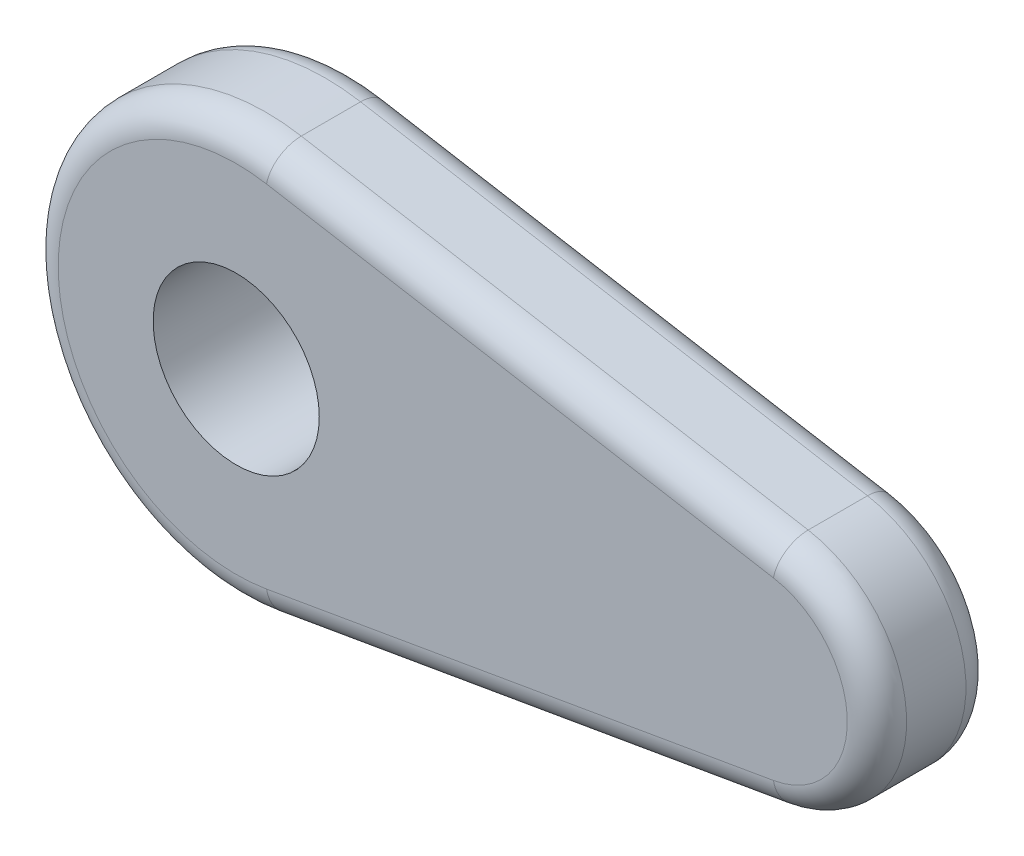
ISO-10303-21;
HEADER;
FILE_DESCRIPTION(('STEP AP214'),'2;1');
FILE_NAME('part.step','',(''),(''),'','','');
FILE_SCHEMA(('AUTOMOTIVE_DESIGN { 1 0 10303 214 1 1 1 1 }'));
ENDSEC;
DATA;
#1=APPLICATION_CONTEXT('core data for automotive mechanical design processes');
#2=APPLICATION_PROTOCOL_DEFINITION('international standard','automotive_design',2000,#1);
#3=PRODUCT_CONTEXT('',#1,'mechanical');
#4=PRODUCT('Part','Part','',(#3));
#5=PRODUCT_RELATED_PRODUCT_CATEGORY('part','',(#4));
#6=PRODUCT_DEFINITION_FORMATION('','',#4);
#7=PRODUCT_DEFINITION_CONTEXT('part definition',#1,'design');
#8=PRODUCT_DEFINITION('design','',#6,#7);
#9=PRODUCT_DEFINITION_SHAPE('','',#8);
#10=(LENGTH_UNIT() NAMED_UNIT(*) SI_UNIT(.MILLI.,.METRE.));
#11=(NAMED_UNIT(*) PLANE_ANGLE_UNIT() SI_UNIT($,.RADIAN.));
#12=(NAMED_UNIT(*) SI_UNIT($,.STERADIAN.) SOLID_ANGLE_UNIT());
#13=UNCERTAINTY_MEASURE_WITH_UNIT(LENGTH_MEASURE(1.E-05),#10,'distance_accuracy_value','');
#14=(GEOMETRIC_REPRESENTATION_CONTEXT(3) GLOBAL_UNCERTAINTY_ASSIGNED_CONTEXT((#13)) GLOBAL_UNIT_ASSIGNED_CONTEXT((#10,
#11,#12)) REPRESENTATION_CONTEXT('',''));
#15=CARTESIAN_POINT('',(0.,0.,0.));
#16=DIRECTION('',(0.,0.,1.));
#17=DIRECTION('',(1.,0.,0.));
#18=AXIS2_PLACEMENT_3D('',#15,#16,#17);
#19=CARTESIAN_POINT('',(49.3729372937294,0.,20.));
#20=DIRECTION('',(0.,0.,1.));
#21=DIRECTION('',(1.,0.,0.));
#22=AXIS2_PLACEMENT_3D('',#19,#20,#21);
#23=PLANE('',#22);
#24=CARTESIAN_POINT('',(49.3729372937294,0.,20.));
#25=DIRECTION('',(0.,0.,1.));
#26=DIRECTION('',(1.,0.,0.));
#27=AXIS2_PLACEMENT_3D('',#24,#25,#26);
#28=CIRCLE('',#27,15.);
#29=CARTESIAN_POINT('',(51.9297554755475,-14.7804831039153,20.));
#30=VERTEX_POINT('',#29);
#31=CARTESIAN_POINT('',(51.9297554755475,14.7804831039153,20.));
#32=VERTEX_POINT('',#31);
#33=EDGE_CURVE('E130',#30,#32,#28,.T.);
#34=ORIENTED_EDGE('',*,*,#33,.T.);
#35=DIRECTION('',(-0.985365540261016,0.170454545454545,0.));
#36=VECTOR('',#35,1.);
#37=CARTESIAN_POINT('',(-33.5134263426343,29.5609662078305,20.));
#38=LINE('',#37,#36);
#39=CARTESIAN_POINT('',(-33.5134263426343,29.5609662078305,20.));
#40=VERTEX_POINT('',#39);
#41=EDGE_CURVE('E111',#32,#40,#38,.T.);
#42=ORIENTED_EDGE('',*,*,#41,.T.);
#43=CARTESIAN_POINT('',(-38.6270627062706,0.,20.));
#44=DIRECTION('',(0.,0.,1.));
#45=DIRECTION('',(1.,0.,0.));
#46=AXIS2_PLACEMENT_3D('',#43,#44,#45);
#47=CIRCLE('',#46,30.);
#48=CARTESIAN_POINT('',(-33.5134263426343,-29.5609662078305,20.));
#49=VERTEX_POINT('',#48);
#50=EDGE_CURVE('E119',#40,#49,#47,.T.);
#51=ORIENTED_EDGE('',*,*,#50,.T.);
#52=DIRECTION('',(0.985365540261016,0.170454545454545,0.));
#53=VECTOR('',#52,1.);
#54=CARTESIAN_POINT('',(51.9297554755475,-14.7804831039153,20.));
#55=LINE('',#54,#53);
#56=EDGE_CURVE('E125',#49,#30,#55,.T.);
#57=ORIENTED_EDGE('',*,*,#56,.T.);
#58=EDGE_LOOP('',(#34,#42,#51,#57));
#59=FACE_BOUND('',#58,.T.);
#60=CARTESIAN_POINT('',(-38.6270627062706,0.,20.));
#61=DIRECTION('',(0.,0.,1.));
#62=DIRECTION('',(1.,0.,0.));
#63=AXIS2_PLACEMENT_3D('',#60,#61,#62);
#64=CIRCLE('',#63,14.);
#65=CARTESIAN_POINT('',(-24.6270627062706,0.,20.));
#66=VERTEX_POINT('',#65);
#67=EDGE_CURVE('E212',#66,#66,#64,.T.);
#68=ORIENTED_EDGE('',*,*,#67,.F.);
#69=EDGE_LOOP('',(#68));
#70=FACE_BOUND('',#69,.T.);
#71=ADVANCED_FACE('F39',(#59,#70),#23,.T.);
#72=CARTESIAN_POINT('',(49.3729372937294,0.,0.));
#73=DIRECTION('',(0.,0.,1.));
#74=DIRECTION('',(1.,0.,0.));
#75=AXIS2_PLACEMENT_3D('',#72,#73,#74);
#76=PLANE('',#75);
#77=CARTESIAN_POINT('',(-38.6270627062706,0.,0.));
#78=DIRECTION('',(0.,0.,1.));
#79=DIRECTION('',(1.,0.,0.));
#80=AXIS2_PLACEMENT_3D('',#77,#78,#79);
#81=CIRCLE('',#80,30.);
#82=CARTESIAN_POINT('',(-33.5134263426343,-29.5609662078305,0.));
#83=VERTEX_POINT('',#82);
#84=CARTESIAN_POINT('',(-33.5134263426343,29.5609662078305,0.));
#85=VERTEX_POINT('',#84);
#86=EDGE_CURVE('E152',#83,#85,#81,.F.);
#87=ORIENTED_EDGE('',*,*,#86,.T.);
#88=DIRECTION('',(-0.985365540261016,0.170454545454545,0.));
#89=VECTOR('',#88,1.);
#90=CARTESIAN_POINT('',(51.9297554755475,14.7804831039153,0.));
#91=LINE('',#90,#89);
#92=CARTESIAN_POINT('',(51.9297554755475,14.7804831039153,0.));
#93=VERTEX_POINT('',#92);
#94=EDGE_CURVE('E158',#85,#93,#91,.F.);
#95=ORIENTED_EDGE('',*,*,#94,.T.);
#96=CARTESIAN_POINT('',(49.3729372937294,0.,0.));
#97=DIRECTION('',(0.,0.,1.));
#98=DIRECTION('',(1.,0.,0.));
#99=AXIS2_PLACEMENT_3D('',#96,#97,#98);
#100=CIRCLE('',#99,15.);
#101=CARTESIAN_POINT('',(51.9297554755475,-14.7804831039152,0.));
#102=VERTEX_POINT('',#101);
#103=EDGE_CURVE('E156',#93,#102,#100,.F.);
#104=ORIENTED_EDGE('',*,*,#103,.T.);
#105=DIRECTION('',(0.985365540261016,0.170454545454545,0.));
#106=VECTOR('',#105,1.);
#107=CARTESIAN_POINT('',(51.9297554755475,-14.7804831039152,0.));
#108=LINE('',#107,#106);
#109=EDGE_CURVE('E154',#102,#83,#108,.F.);
#110=ORIENTED_EDGE('',*,*,#109,.T.);
#111=EDGE_LOOP('',(#87,#95,#104,#110));
#112=FACE_BOUND('',#111,.T.);
#113=CARTESIAN_POINT('',(-38.6270627062706,0.,0.));
#114=DIRECTION('',(0.,0.,1.));
#115=DIRECTION('',(1.,0.,0.));
#116=AXIS2_PLACEMENT_3D('',#113,#114,#115);
#117=CIRCLE('',#116,14.);
#118=CARTESIAN_POINT('',(-24.6270627062706,0.,0.));
#119=VERTEX_POINT('',#118);
#120=EDGE_CURVE('E149',#119,#119,#117,.T.);
#121=ORIENTED_EDGE('',*,*,#120,.T.);
#122=EDGE_LOOP('',(#121));
#123=FACE_BOUND('',#122,.T.);
#124=ADVANCED_FACE('F182',(#112,#123),#76,.F.);
#125=CARTESIAN_POINT('',(49.3729372937294,0.,20.));
#126=DIRECTION('',(0.,0.,-1.));
#127=DIRECTION('',(-1.,0.,0.));
#128=AXIS2_PLACEMENT_3D('',#125,#126,#127);
#129=CYLINDRICAL_SURFACE('',#128,20.);
#130=DIRECTION('',(0.,0.,-1.));
#131=VECTOR('',#130,1.);
#132=CARTESIAN_POINT('',(52.7820282028203,-19.7073108052203,20.));
#133=LINE('',#132,#131);
#134=CARTESIAN_POINT('',(52.7820282028203,-19.7073108052203,15.));
#135=VERTEX_POINT('',#134);
#136=CARTESIAN_POINT('',(52.7820282028203,-19.7073108052203,5.));
#137=VERTEX_POINT('',#136);
#138=EDGE_CURVE('E200',#135,#137,#133,.T.);
#139=ORIENTED_EDGE('',*,*,#138,.T.);
#140=CARTESIAN_POINT('',(49.3729372937294,0.,5.));
#141=DIRECTION('',(0.,0.,1.));
#142=DIRECTION('',(1.,0.,0.));
#143=AXIS2_PLACEMENT_3D('',#140,#141,#142);
#144=CIRCLE('',#143,20.);
#145=CARTESIAN_POINT('',(52.7820282028203,19.7073108052203,5.));
#146=VERTEX_POINT('',#145);
#147=EDGE_CURVE('E161',#137,#146,#144,.T.);
#148=ORIENTED_EDGE('',*,*,#147,.T.);
#149=DIRECTION('',(0.,0.,-1.));
#150=VECTOR('',#149,1.);
#151=CARTESIAN_POINT('',(52.7820282028203,19.7073108052203,20.));
#152=LINE('',#151,#150);
#153=CARTESIAN_POINT('',(52.7820282028203,19.7073108052203,15.));
#154=VERTEX_POINT('',#153);
#155=EDGE_CURVE('E126',#154,#146,#152,.T.);
#156=ORIENTED_EDGE('',*,*,#155,.F.);
#157=CARTESIAN_POINT('',(49.3729372937294,0.,15.));
#158=DIRECTION('',(0.,0.,1.));
#159=DIRECTION('',(1.,0.,0.));
#160=AXIS2_PLACEMENT_3D('',#157,#158,#159);
#161=CIRCLE('',#160,20.);
#162=EDGE_CURVE('E133',#154,#135,#161,.F.);
#163=ORIENTED_EDGE('',*,*,#162,.T.);
#164=EDGE_LOOP('',(#139,#148,#156,#163));
#165=FACE_BOUND('',#164,.T.);
#166=ADVANCED_FACE('F211',(#165),#129,.T.);
#167=CARTESIAN_POINT('',(-32.6611536153615,34.4877939091356,20.));
#168=DIRECTION('',(-0.170454545454545,-0.985365540261016,0.));
#169=DIRECTION('',(0.985365540261016,-0.170454545454545,0.));
#170=AXIS2_PLACEMENT_3D('',#167,#168,#169);
#171=PLANE('',#170);
#172=ORIENTED_EDGE('',*,*,#155,.T.);
#173=DIRECTION('',(-0.985365540261016,0.170454545454545,0.));
#174=VECTOR('',#173,1.);
#175=CARTESIAN_POINT('',(-32.6611536153615,34.4877939091356,5.));
#176=LINE('',#175,#174);
#177=CARTESIAN_POINT('',(-32.6611536153615,34.4877939091356,5.));
#178=VERTEX_POINT('',#177);
#179=EDGE_CURVE('E142',#146,#178,#176,.T.);
#180=ORIENTED_EDGE('',*,*,#179,.T.);
#181=DIRECTION('',(0.,0.,-1.));
#182=VECTOR('',#181,1.);
#183=CARTESIAN_POINT('',(-32.6611536153615,34.4877939091356,20.));
#184=LINE('',#183,#182);
#185=CARTESIAN_POINT('',(-32.6611536153615,34.4877939091356,15.));
#186=VERTEX_POINT('',#185);
#187=EDGE_CURVE('E194',#186,#178,#184,.T.);
#188=ORIENTED_EDGE('',*,*,#187,.F.);
#189=DIRECTION('',(-0.985365540261016,0.170454545454545,0.));
#190=VECTOR('',#189,1.);
#191=CARTESIAN_POINT('',(52.7820282028203,19.7073108052203,15.));
#192=LINE('',#191,#190);
#193=EDGE_CURVE('E113',#186,#154,#192,.F.);
#194=ORIENTED_EDGE('',*,*,#193,.T.);
#195=EDGE_LOOP('',(#172,#180,#188,#194));
#196=FACE_BOUND('',#195,.T.);
#197=ADVANCED_FACE('F193',(#196),#171,.F.);
#198=CARTESIAN_POINT('',(-38.6270627062706,0.,20.));
#199=DIRECTION('',(0.,0.,-1.));
#200=DIRECTION('',(-1.,0.,0.));
#201=AXIS2_PLACEMENT_3D('',#198,#199,#200);
#202=CYLINDRICAL_SURFACE('',#201,35.);
#203=ORIENTED_EDGE('',*,*,#187,.T.);
#204=CARTESIAN_POINT('',(-38.6270627062706,0.,5.));
#205=DIRECTION('',(0.,0.,1.));
#206=DIRECTION('',(1.,0.,0.));
#207=AXIS2_PLACEMENT_3D('',#204,#205,#206);
#208=CIRCLE('',#207,35.);
#209=CARTESIAN_POINT('',(-32.6611536153615,-34.4877939091356,5.));
#210=VERTEX_POINT('',#209);
#211=EDGE_CURVE('E11',#178,#210,#208,.T.);
#212=ORIENTED_EDGE('',*,*,#211,.T.);
#213=DIRECTION('',(0.,0.,-1.));
#214=VECTOR('',#213,1.);
#215=CARTESIAN_POINT('',(-32.6611536153615,-34.4877939091356,20.));
#216=LINE('',#215,#214);
#217=CARTESIAN_POINT('',(-32.6611536153615,-34.4877939091356,15.));
#218=VERTEX_POINT('',#217);
#219=EDGE_CURVE('E197',#218,#210,#216,.T.);
#220=ORIENTED_EDGE('',*,*,#219,.F.);
#221=CARTESIAN_POINT('',(-38.6270627062706,0.,15.));
#222=DIRECTION('',(0.,0.,1.));
#223=DIRECTION('',(1.,0.,0.));
#224=AXIS2_PLACEMENT_3D('',#221,#222,#223);
#225=CIRCLE('',#224,35.);
#226=EDGE_CURVE('E141',#218,#186,#225,.F.);
#227=ORIENTED_EDGE('',*,*,#226,.T.);
#228=EDGE_LOOP('',(#203,#212,#220,#227));
#229=FACE_BOUND('',#228,.T.);
#230=ADVANCED_FACE('F196',(#229),#202,.T.);
#231=CARTESIAN_POINT('',(-32.6611536153615,-34.4877939091356,20.));
#232=DIRECTION('',(-0.170454545454545,0.985365540261016,0.));
#233=DIRECTION('',(-0.985365540261016,-0.170454545454545,0.));
#234=AXIS2_PLACEMENT_3D('',#231,#232,#233);
#235=PLANE('',#234);
#236=ORIENTED_EDGE('',*,*,#219,.T.);
#237=DIRECTION('',(0.985365540261016,0.170454545454545,0.));
#238=VECTOR('',#237,1.);
#239=CARTESIAN_POINT('',(-32.6611536153615,-34.4877939091356,5.));
#240=LINE('',#239,#238);
#241=EDGE_CURVE('E48',#210,#137,#240,.T.);
#242=ORIENTED_EDGE('',*,*,#241,.T.);
#243=ORIENTED_EDGE('',*,*,#138,.F.);
#244=DIRECTION('',(0.985365540261016,0.170454545454545,0.));
#245=VECTOR('',#244,1.);
#246=CARTESIAN_POINT('',(-32.6611536153616,-34.4877939091356,15.));
#247=LINE('',#246,#245);
#248=EDGE_CURVE('E139',#135,#218,#247,.F.);
#249=ORIENTED_EDGE('',*,*,#248,.T.);
#250=EDGE_LOOP('',(#236,#242,#243,#249));
#251=FACE_BOUND('',#250,.T.);
#252=ADVANCED_FACE('F221',(#251),#235,.F.);
#253=CARTESIAN_POINT('',(-38.6270627062706,0.,20.));
#254=DIRECTION('',(0.,0.,-1.));
#255=DIRECTION('',(-1.,0.,0.));
#256=AXIS2_PLACEMENT_3D('',#253,#254,#255);
#257=CYLINDRICAL_SURFACE('',#256,14.);
#258=ORIENTED_EDGE('',*,*,#67,.T.);
#259=EDGE_LOOP('',(#258));
#260=FACE_BOUND('',#259,.T.);
#261=ORIENTED_EDGE('',*,*,#120,.F.);
#262=EDGE_LOOP('',(#261));
#263=FACE_BOUND('',#262,.T.);
#264=ADVANCED_FACE('F219',(#260,#263),#257,.F.);
#265=CARTESIAN_POINT('',(51.9297554755475,-14.7804831039153,15.));
#266=DIRECTION('',(-0.985365540261016,-0.170454545454545,0.));
#267=DIRECTION('',(0.170454545454545,-0.985365540261016,0.));
#268=AXIS2_PLACEMENT_3D('',#265,#266,#267);
#269=CYLINDRICAL_SURFACE('',#268,5.);
#270=CARTESIAN_POINT('',(-33.5134263426343,-29.5609662078305,15.));
#271=DIRECTION('',(-0.985365540261016,-0.170454545454546,0.));
#272=DIRECTION('',(0.170454545454546,-0.985365540261016,0.));
#273=AXIS2_PLACEMENT_3D('',#270,#271,#272);
#274=CIRCLE('',#273,5.);
#275=EDGE_CURVE('E122',#218,#49,#274,.T.);
#276=ORIENTED_EDGE('',*,*,#275,.F.);
#277=ORIENTED_EDGE('',*,*,#248,.F.);
#278=CARTESIAN_POINT('',(51.9297554755475,-14.7804831039153,15.));
#279=DIRECTION('',(0.985365540261016,0.170454545454546,0.));
#280=DIRECTION('',(-0.170454545454546,0.985365540261016,0.));
#281=AXIS2_PLACEMENT_3D('',#278,#279,#280);
#282=CIRCLE('',#281,5.);
#283=EDGE_CURVE('E146',#30,#135,#282,.T.);
#284=ORIENTED_EDGE('',*,*,#283,.F.);
#285=ORIENTED_EDGE('',*,*,#56,.F.);
#286=EDGE_LOOP('',(#276,#277,#284,#285));
#287=FACE_BOUND('',#286,.T.);
#288=ADVANCED_FACE('F206',(#287),#269,.T.);
#289=CARTESIAN_POINT('',(49.3729372937294,0.,15.));
#290=DIRECTION('',(0.,0.,1.));
#291=DIRECTION('',(1.,0.,0.));
#292=AXIS2_PLACEMENT_3D('',#289,#290,#291);
#293=TOROIDAL_SURFACE('',#292,15.,5.);
#294=ORIENTED_EDGE('',*,*,#283,.T.);
#295=ORIENTED_EDGE('',*,*,#162,.F.);
#296=CARTESIAN_POINT('',(51.9297554755475,14.7804831039153,15.));
#297=DIRECTION('',(-0.985365540261016,0.170454545454546,0.));
#298=DIRECTION('',(-0.170454545454546,-0.985365540261016,0.));
#299=AXIS2_PLACEMENT_3D('',#296,#297,#298);
#300=CIRCLE('',#299,5.);
#301=EDGE_CURVE('E116',#32,#154,#300,.T.);
#302=ORIENTED_EDGE('',*,*,#301,.F.);
#303=ORIENTED_EDGE('',*,*,#33,.F.);
#304=EDGE_LOOP('',(#294,#295,#302,#303));
#305=FACE_BOUND('',#304,.T.);
#306=ADVANCED_FACE('F209',(#305),#293,.T.);
#307=CARTESIAN_POINT('',(-38.6270627062706,0.,15.));
#308=DIRECTION('',(0.,0.,1.));
#309=DIRECTION('',(1.,0.,0.));
#310=AXIS2_PLACEMENT_3D('',#307,#308,#309);
#311=TOROIDAL_SURFACE('',#310,30.,5.);
#312=ORIENTED_EDGE('',*,*,#275,.T.);
#313=ORIENTED_EDGE('',*,*,#50,.F.);
#314=CARTESIAN_POINT('',(-33.5134263426343,29.5609662078305,15.));
#315=DIRECTION('',(0.985365540261016,-0.170454545454546,0.));
#316=DIRECTION('',(0.170454545454546,0.985365540261016,0.));
#317=AXIS2_PLACEMENT_3D('',#314,#315,#316);
#318=CIRCLE('',#317,5.);
#319=EDGE_CURVE('E107',#186,#40,#318,.T.);
#320=ORIENTED_EDGE('',*,*,#319,.F.);
#321=ORIENTED_EDGE('',*,*,#226,.F.);
#322=EDGE_LOOP('',(#312,#313,#320,#321));
#323=FACE_BOUND('',#322,.T.);
#324=ADVANCED_FACE('F120',(#323),#311,.T.);
#325=CARTESIAN_POINT('',(51.9297554755475,14.7804831039153,15.));
#326=DIRECTION('',(0.985365540261016,-0.170454545454545,0.));
#327=DIRECTION('',(0.170454545454545,0.985365540261016,0.));
#328=AXIS2_PLACEMENT_3D('',#325,#326,#327);
#329=CYLINDRICAL_SURFACE('',#328,5.);
#330=ORIENTED_EDGE('',*,*,#301,.T.);
#331=ORIENTED_EDGE('',*,*,#193,.F.);
#332=ORIENTED_EDGE('',*,*,#319,.T.);
#333=ORIENTED_EDGE('',*,*,#41,.F.);
#334=EDGE_LOOP('',(#330,#331,#332,#333));
#335=FACE_BOUND('',#334,.T.);
#336=ADVANCED_FACE('F109',(#335),#329,.T.);
#337=CARTESIAN_POINT('',(-33.5134263426343,-29.5609662078305,5.));
#338=DIRECTION('',(0.985365540261016,0.170454545454545,0.));
#339=DIRECTION('',(-0.170454545454545,0.985365540261016,0.));
#340=AXIS2_PLACEMENT_3D('',#337,#338,#339);
#341=CYLINDRICAL_SURFACE('',#340,5.);
#342=CARTESIAN_POINT('',(-33.5134263426343,-29.5609662078305,5.));
#343=DIRECTION('',(-0.985365540261016,-0.170454545454546,0.));
#344=DIRECTION('',(0.170454545454546,-0.985365540261016,0.));
#345=AXIS2_PLACEMENT_3D('',#342,#343,#344);
#346=CIRCLE('',#345,5.);
#347=EDGE_CURVE('E167',#83,#210,#346,.T.);
#348=ORIENTED_EDGE('',*,*,#347,.F.);
#349=ORIENTED_EDGE('',*,*,#109,.F.);
#350=CARTESIAN_POINT('',(51.9297554755475,-14.7804831039153,5.));
#351=DIRECTION('',(0.985365540261016,0.170454545454546,0.));
#352=DIRECTION('',(-0.170454545454546,0.985365540261016,0.));
#353=AXIS2_PLACEMENT_3D('',#350,#351,#352);
#354=CIRCLE('',#353,5.);
#355=EDGE_CURVE('E43',#137,#102,#354,.T.);
#356=ORIENTED_EDGE('',*,*,#355,.F.);
#357=ORIENTED_EDGE('',*,*,#241,.F.);
#358=EDGE_LOOP('',(#348,#349,#356,#357));
#359=FACE_BOUND('',#358,.T.);
#360=ADVANCED_FACE('F41',(#359),#341,.T.);
#361=CARTESIAN_POINT('',(49.3729372937294,0.,5.));
#362=DIRECTION('',(0.,0.,1.));
#363=DIRECTION('',(1.,0.,0.));
#364=AXIS2_PLACEMENT_3D('',#361,#362,#363);
#365=TOROIDAL_SURFACE('',#364,15.,5.);
#366=ORIENTED_EDGE('',*,*,#355,.T.);
#367=ORIENTED_EDGE('',*,*,#103,.F.);
#368=CARTESIAN_POINT('',(51.9297554755475,14.7804831039153,5.));
#369=DIRECTION('',(-0.985365540261016,0.170454545454546,0.));
#370=DIRECTION('',(-0.170454545454546,-0.985365540261016,0.));
#371=AXIS2_PLACEMENT_3D('',#368,#369,#370);
#372=CIRCLE('',#371,5.);
#373=EDGE_CURVE('E166',#146,#93,#372,.T.);
#374=ORIENTED_EDGE('',*,*,#373,.F.);
#375=ORIENTED_EDGE('',*,*,#147,.F.);
#376=EDGE_LOOP('',(#366,#367,#374,#375));
#377=FACE_BOUND('',#376,.T.);
#378=ADVANCED_FACE('F177',(#377),#365,.T.);
#379=CARTESIAN_POINT('',(-38.6270627062706,0.,5.));
#380=DIRECTION('',(0.,0.,1.));
#381=DIRECTION('',(1.,0.,0.));
#382=AXIS2_PLACEMENT_3D('',#379,#380,#381);
#383=TOROIDAL_SURFACE('',#382,30.,5.);
#384=ORIENTED_EDGE('',*,*,#347,.T.);
#385=ORIENTED_EDGE('',*,*,#211,.F.);
#386=CARTESIAN_POINT('',(-33.5134263426343,29.5609662078305,5.));
#387=DIRECTION('',(0.985365540261016,-0.170454545454546,0.));
#388=DIRECTION('',(0.170454545454546,0.985365540261016,0.));
#389=AXIS2_PLACEMENT_3D('',#386,#387,#388);
#390=CIRCLE('',#389,5.);
#391=EDGE_CURVE('E164',#85,#178,#390,.T.);
#392=ORIENTED_EDGE('',*,*,#391,.F.);
#393=ORIENTED_EDGE('',*,*,#86,.F.);
#394=EDGE_LOOP('',(#384,#385,#392,#393));
#395=FACE_BOUND('',#394,.T.);
#396=ADVANCED_FACE('F189',(#395),#383,.T.);
#397=CARTESIAN_POINT('',(-33.5134263426343,29.5609662078305,5.));
#398=DIRECTION('',(-0.985365540261016,0.170454545454545,0.));
#399=DIRECTION('',(-0.170454545454545,-0.985365540261016,0.));
#400=AXIS2_PLACEMENT_3D('',#397,#398,#399);
#401=CYLINDRICAL_SURFACE('',#400,5.);
#402=ORIENTED_EDGE('',*,*,#373,.T.);
#403=ORIENTED_EDGE('',*,*,#94,.F.);
#404=ORIENTED_EDGE('',*,*,#391,.T.);
#405=ORIENTED_EDGE('',*,*,#179,.F.);
#406=EDGE_LOOP('',(#402,#403,#404,#405));
#407=FACE_BOUND('',#406,.T.);
#408=ADVANCED_FACE('F187',(#407),#401,.T.);
#409=CLOSED_SHELL('',(#71,#124,#166,#197,#230,#252,#264,#288,#306,#324,#336,#360,#378,#396,#408));
#410=MANIFOLD_SOLID_BREP('B2',#409);
#411=ADVANCED_BREP_SHAPE_REPRESENTATION('',(#18,#410),#14);
#412=SHAPE_DEFINITION_REPRESENTATION(#9,#411);
ENDSEC;
END-ISO-10303-21;
